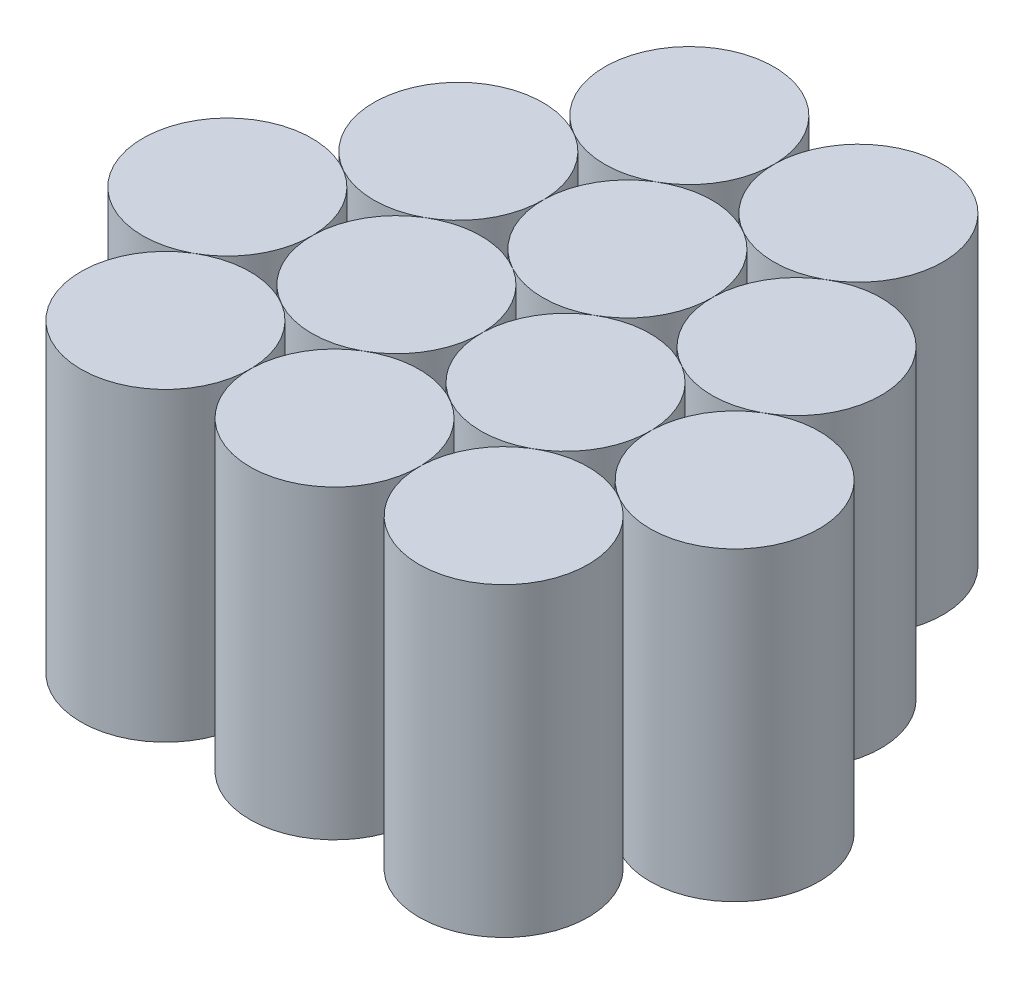
ISO-10303-21;
HEADER;
FILE_DESCRIPTION(('STEP AP214'),'2;1');
FILE_NAME('part.step','',(''),(''),'','','');
FILE_SCHEMA(('AUTOMOTIVE_DESIGN { 1 0 10303 214 1 1 1 1 }'));
ENDSEC;
DATA;
#1=APPLICATION_CONTEXT('core data for automotive mechanical design processes');
#2=APPLICATION_PROTOCOL_DEFINITION('international standard','automotive_design',2000,#1);
#3=PRODUCT_CONTEXT('',#1,'mechanical');
#4=PRODUCT('Part','Part','',(#3));
#5=PRODUCT_RELATED_PRODUCT_CATEGORY('part','',(#4));
#6=PRODUCT_DEFINITION_FORMATION('','',#4);
#7=PRODUCT_DEFINITION_CONTEXT('part definition',#1,'design');
#8=PRODUCT_DEFINITION('design','',#6,#7);
#9=PRODUCT_DEFINITION_SHAPE('','',#8);
#10=(LENGTH_UNIT() NAMED_UNIT(*) SI_UNIT(.MILLI.,.METRE.));
#11=(NAMED_UNIT(*) PLANE_ANGLE_UNIT() SI_UNIT($,.RADIAN.));
#12=(NAMED_UNIT(*) SI_UNIT($,.STERADIAN.) SOLID_ANGLE_UNIT());
#13=UNCERTAINTY_MEASURE_WITH_UNIT(LENGTH_MEASURE(1.E-05),#10,'distance_accuracy_value','');
#14=(GEOMETRIC_REPRESENTATION_CONTEXT(3) GLOBAL_UNCERTAINTY_ASSIGNED_CONTEXT((#13)) GLOBAL_UNIT_ASSIGNED_CONTEXT((#10,
#11,#12)) REPRESENTATION_CONTEXT('',''));
#15=CARTESIAN_POINT('',(0.,0.,0.));
#16=DIRECTION('',(0.,0.,1.));
#17=DIRECTION('',(1.,0.,0.));
#18=AXIS2_PLACEMENT_3D('',#15,#16,#17);
#19=CARTESIAN_POINT('',(34.036,61.5,39.3013875242762));
#20=DIRECTION('',(0.,-1.,0.));
#21=DIRECTION('',(0.,0.,-1.));
#22=AXIS2_PLACEMENT_3D('',#19,#20,#21);
#23=CYLINDRICAL_SURFACE('',#22,17.018);
#24=CARTESIAN_POINT('',(34.036,0.,39.3013875242762));
#25=DIRECTION('',(0.,1.,0.));
#26=DIRECTION('',(0.,0.,1.));
#27=AXIS2_PLACEMENT_3D('',#24,#25,#26);
#28=CIRCLE('',#27,17.018);
#29=CARTESIAN_POINT('',(34.036,0.,56.3193875242762));
#30=VERTEX_POINT('',#29);
#31=EDGE_CURVE('E12',#30,#30,#28,.T.);
#32=ORIENTED_EDGE('',*,*,#31,.T.);
#33=EDGE_LOOP('',(#32));
#34=FACE_BOUND('',#33,.T.);
#35=CARTESIAN_POINT('',(34.036,61.5,39.3013875242762));
#36=DIRECTION('',(0.,1.,0.));
#37=DIRECTION('',(0.,0.,1.));
#38=AXIS2_PLACEMENT_3D('',#35,#36,#37);
#39=CIRCLE('',#38,17.018);
#40=CARTESIAN_POINT('',(34.036,61.5,56.3193875242762));
#41=VERTEX_POINT('',#40);
#42=EDGE_CURVE('E187',#41,#41,#39,.T.);
#43=ORIENTED_EDGE('',*,*,#42,.F.);
#44=EDGE_LOOP('',(#43));
#45=FACE_BOUND('',#44,.T.);
#46=ADVANCED_FACE('F183',(#34,#45),#23,.T.);
#47=CARTESIAN_POINT('',(0.,61.5,0.));
#48=DIRECTION('',(0.,1.,0.));
#49=DIRECTION('',(0.,0.,1.));
#50=AXIS2_PLACEMENT_3D('',#47,#48,#49);
#51=PLANE('',#50);
#52=ORIENTED_EDGE('',*,*,#42,.T.);
#53=EDGE_LOOP('',(#52));
#54=FACE_BOUND('',#53,.T.);
#55=ADVANCED_FACE('F185',(#54),#51,.T.);
#56=CARTESIAN_POINT('',(0.,0.,0.));
#57=DIRECTION('',(0.,1.,0.));
#58=DIRECTION('',(0.,0.,1.));
#59=AXIS2_PLACEMENT_3D('',#56,#57,#58);
#60=PLANE('',#59);
#61=ORIENTED_EDGE('',*,*,#31,.F.);
#62=EDGE_LOOP('',(#61));
#63=FACE_BOUND('',#62,.T.);
#64=ADVANCED_FACE('F204',(#63),#60,.F.);
#65=CLOSED_SHELL('',(#46,#55,#64));
#66=MANIFOLD_SOLID_BREP('B2',#65);
#67=CARTESIAN_POINT('',(51.054,61.5,9.82534688106906));
#68=DIRECTION('',(0.,-1.,0.));
#69=DIRECTION('',(0.,0.,-1.));
#70=AXIS2_PLACEMENT_3D('',#67,#68,#69);
#71=CYLINDRICAL_SURFACE('',#70,17.018);
#72=CARTESIAN_POINT('',(51.054,0.,9.82534688106906));
#73=DIRECTION('',(0.,1.,0.));
#74=DIRECTION('',(0.,0.,1.));
#75=AXIS2_PLACEMENT_3D('',#72,#73,#74);
#76=CIRCLE('',#75,17.018);
#77=CARTESIAN_POINT('',(51.054,0.,26.8433468810691));
#78=VERTEX_POINT('',#77);
#79=EDGE_CURVE('E182',#78,#78,#76,.T.);
#80=ORIENTED_EDGE('',*,*,#79,.T.);
#81=EDGE_LOOP('',(#80));
#82=FACE_BOUND('',#81,.T.);
#83=CARTESIAN_POINT('',(51.054,61.5,9.82534688106906));
#84=DIRECTION('',(0.,1.,0.));
#85=DIRECTION('',(0.,0.,1.));
#86=AXIS2_PLACEMENT_3D('',#83,#84,#85);
#87=CIRCLE('',#86,17.018);
#88=CARTESIAN_POINT('',(51.054,61.5,26.8433468810691));
#89=VERTEX_POINT('',#88);
#90=EDGE_CURVE('E240',#89,#89,#87,.T.);
#91=ORIENTED_EDGE('',*,*,#90,.F.);
#92=EDGE_LOOP('',(#91));
#93=FACE_BOUND('',#92,.T.);
#94=ADVANCED_FACE('F236',(#82,#93),#71,.T.);
#95=CARTESIAN_POINT('',(0.,61.5,0.));
#96=DIRECTION('',(0.,1.,0.));
#97=DIRECTION('',(0.,0.,1.));
#98=AXIS2_PLACEMENT_3D('',#95,#96,#97);
#99=PLANE('',#98);
#100=ORIENTED_EDGE('',*,*,#90,.T.);
#101=EDGE_LOOP('',(#100));
#102=FACE_BOUND('',#101,.T.);
#103=ADVANCED_FACE('F238',(#102),#99,.T.);
#104=CARTESIAN_POINT('',(0.,0.,0.));
#105=DIRECTION('',(0.,1.,0.));
#106=DIRECTION('',(0.,0.,1.));
#107=AXIS2_PLACEMENT_3D('',#104,#105,#106);
#108=PLANE('',#107);
#109=ORIENTED_EDGE('',*,*,#79,.F.);
#110=EDGE_LOOP('',(#109));
#111=FACE_BOUND('',#110,.T.);
#112=ADVANCED_FACE('F257',(#111),#108,.F.);
#113=CLOSED_SHELL('',(#94,#103,#112));
#114=MANIFOLD_SOLID_BREP('B7',#113);
#115=CARTESIAN_POINT('',(0.,61.5,39.3013875242762));
#116=DIRECTION('',(0.,-1.,0.));
#117=DIRECTION('',(0.,0.,-1.));
#118=AXIS2_PLACEMENT_3D('',#115,#116,#117);
#119=CYLINDRICAL_SURFACE('',#118,17.018);
#120=CARTESIAN_POINT('',(0.,0.,39.3013875242762));
#121=DIRECTION('',(0.,1.,0.));
#122=DIRECTION('',(0.,0.,1.));
#123=AXIS2_PLACEMENT_3D('',#120,#121,#122);
#124=CIRCLE('',#123,17.018);
#125=CARTESIAN_POINT('',(0.,0.,56.3193875242762));
#126=VERTEX_POINT('',#125);
#127=EDGE_CURVE('E235',#126,#126,#124,.T.);
#128=ORIENTED_EDGE('',*,*,#127,.T.);
#129=EDGE_LOOP('',(#128));
#130=FACE_BOUND('',#129,.T.);
#131=CARTESIAN_POINT('',(0.,61.5,39.3013875242762));
#132=DIRECTION('',(0.,1.,0.));
#133=DIRECTION('',(0.,0.,1.));
#134=AXIS2_PLACEMENT_3D('',#131,#132,#133);
#135=CIRCLE('',#134,17.018);
#136=CARTESIAN_POINT('',(0.,61.5,56.3193875242762));
#137=VERTEX_POINT('',#136);
#138=EDGE_CURVE('E293',#137,#137,#135,.T.);
#139=ORIENTED_EDGE('',*,*,#138,.F.);
#140=EDGE_LOOP('',(#139));
#141=FACE_BOUND('',#140,.T.);
#142=ADVANCED_FACE('F289',(#130,#141),#119,.T.);
#143=CARTESIAN_POINT('',(0.,61.5,39.3013875242762));
#144=DIRECTION('',(0.,1.,0.));
#145=DIRECTION('',(0.,0.,1.));
#146=AXIS2_PLACEMENT_3D('',#143,#144,#145);
#147=PLANE('',#146);
#148=ORIENTED_EDGE('',*,*,#138,.T.);
#149=EDGE_LOOP('',(#148));
#150=FACE_BOUND('',#149,.T.);
#151=ADVANCED_FACE('F291',(#150),#147,.T.);
#152=CARTESIAN_POINT('',(0.,0.,39.3013875242762));
#153=DIRECTION('',(0.,1.,0.));
#154=DIRECTION('',(0.,0.,1.));
#155=AXIS2_PLACEMENT_3D('',#152,#153,#154);
#156=PLANE('',#155);
#157=ORIENTED_EDGE('',*,*,#127,.F.);
#158=EDGE_LOOP('',(#157));
#159=FACE_BOUND('',#158,.T.);
#160=ADVANCED_FACE('F309',(#159),#156,.F.);
#161=CLOSED_SHELL('',(#142,#151,#160));
#162=MANIFOLD_SOLID_BREP('B177',#161);
#163=CARTESIAN_POINT('',(17.018,61.5,9.82534688106906));
#164=DIRECTION('',(0.,-1.,0.));
#165=DIRECTION('',(0.,0.,-1.));
#166=AXIS2_PLACEMENT_3D('',#163,#164,#165);
#167=CYLINDRICAL_SURFACE('',#166,17.018);
#168=CARTESIAN_POINT('',(17.018,0.,9.82534688106906));
#169=DIRECTION('',(0.,1.,0.));
#170=DIRECTION('',(0.,0.,1.));
#171=AXIS2_PLACEMENT_3D('',#168,#169,#170);
#172=CIRCLE('',#171,17.018);
#173=CARTESIAN_POINT('',(17.018,0.,26.8433468810691));
#174=VERTEX_POINT('',#173);
#175=EDGE_CURVE('E288',#174,#174,#172,.T.);
#176=ORIENTED_EDGE('',*,*,#175,.T.);
#177=EDGE_LOOP('',(#176));
#178=FACE_BOUND('',#177,.T.);
#179=CARTESIAN_POINT('',(17.018,61.5,9.82534688106906));
#180=DIRECTION('',(0.,1.,0.));
#181=DIRECTION('',(0.,0.,1.));
#182=AXIS2_PLACEMENT_3D('',#179,#180,#181);
#183=CIRCLE('',#182,17.018);
#184=CARTESIAN_POINT('',(17.018,61.5,26.8433468810691));
#185=VERTEX_POINT('',#184);
#186=EDGE_CURVE('E344',#185,#185,#183,.T.);
#187=ORIENTED_EDGE('',*,*,#186,.F.);
#188=EDGE_LOOP('',(#187));
#189=FACE_BOUND('',#188,.T.);
#190=ADVANCED_FACE('F340',(#178,#189),#167,.T.);
#191=CARTESIAN_POINT('',(17.018,61.5,9.82534688106906));
#192=DIRECTION('',(0.,1.,0.));
#193=DIRECTION('',(0.,0.,1.));
#194=AXIS2_PLACEMENT_3D('',#191,#192,#193);
#195=PLANE('',#194);
#196=ORIENTED_EDGE('',*,*,#186,.T.);
#197=EDGE_LOOP('',(#196));
#198=FACE_BOUND('',#197,.T.);
#199=ADVANCED_FACE('F342',(#198),#195,.T.);
#200=CARTESIAN_POINT('',(17.018,0.,9.82534688106906));
#201=DIRECTION('',(0.,1.,0.));
#202=DIRECTION('',(0.,0.,1.));
#203=AXIS2_PLACEMENT_3D('',#200,#201,#202);
#204=PLANE('',#203);
#205=ORIENTED_EDGE('',*,*,#175,.F.);
#206=EDGE_LOOP('',(#205));
#207=FACE_BOUND('',#206,.T.);
#208=ADVANCED_FACE('F361',(#207),#204,.F.);
#209=CLOSED_SHELL('',(#190,#199,#208));
#210=MANIFOLD_SOLID_BREP('B230',#209);
#211=CARTESIAN_POINT('',(34.036,61.5,-19.6506937621381));
#212=DIRECTION('',(0.,-1.,0.));
#213=DIRECTION('',(0.,0.,-1.));
#214=AXIS2_PLACEMENT_3D('',#211,#212,#213);
#215=CYLINDRICAL_SURFACE('',#214,17.018);
#216=CARTESIAN_POINT('',(34.036,0.,-19.6506937621381));
#217=DIRECTION('',(0.,1.,0.));
#218=DIRECTION('',(0.,0.,1.));
#219=AXIS2_PLACEMENT_3D('',#216,#217,#218);
#220=CIRCLE('',#219,17.018);
#221=CARTESIAN_POINT('',(34.036,0.,-2.63269376213808));
#222=VERTEX_POINT('',#221);
#223=EDGE_CURVE('E339',#222,#222,#220,.T.);
#224=ORIENTED_EDGE('',*,*,#223,.T.);
#225=EDGE_LOOP('',(#224));
#226=FACE_BOUND('',#225,.T.);
#227=CARTESIAN_POINT('',(34.036,61.5,-19.6506937621381));
#228=DIRECTION('',(0.,1.,0.));
#229=DIRECTION('',(0.,0.,1.));
#230=AXIS2_PLACEMENT_3D('',#227,#228,#229);
#231=CIRCLE('',#230,17.018);
#232=CARTESIAN_POINT('',(34.036,61.5,-2.63269376213808));
#233=VERTEX_POINT('',#232);
#234=EDGE_CURVE('E397',#233,#233,#231,.T.);
#235=ORIENTED_EDGE('',*,*,#234,.F.);
#236=EDGE_LOOP('',(#235));
#237=FACE_BOUND('',#236,.T.);
#238=ADVANCED_FACE('F393',(#226,#237),#215,.T.);
#239=CARTESIAN_POINT('',(0.,61.5,0.));
#240=DIRECTION('',(0.,1.,0.));
#241=DIRECTION('',(0.,0.,1.));
#242=AXIS2_PLACEMENT_3D('',#239,#240,#241);
#243=PLANE('',#242);
#244=ORIENTED_EDGE('',*,*,#234,.T.);
#245=EDGE_LOOP('',(#244));
#246=FACE_BOUND('',#245,.T.);
#247=ADVANCED_FACE('F395',(#246),#243,.T.);
#248=CARTESIAN_POINT('',(0.,0.,0.));
#249=DIRECTION('',(0.,1.,0.));
#250=DIRECTION('',(0.,0.,1.));
#251=AXIS2_PLACEMENT_3D('',#248,#249,#250);
#252=PLANE('',#251);
#253=ORIENTED_EDGE('',*,*,#223,.F.);
#254=EDGE_LOOP('',(#253));
#255=FACE_BOUND('',#254,.T.);
#256=ADVANCED_FACE('F413',(#255),#252,.F.);
#257=CLOSED_SHELL('',(#238,#247,#256));
#258=MANIFOLD_SOLID_BREP('B283',#257);
#259=CARTESIAN_POINT('',(17.018,61.5,-49.1267344053453));
#260=DIRECTION('',(0.,-1.,0.));
#261=DIRECTION('',(0.,0.,-1.));
#262=AXIS2_PLACEMENT_3D('',#259,#260,#261);
#263=CYLINDRICAL_SURFACE('',#262,17.018);
#264=CARTESIAN_POINT('',(17.018,0.,-49.1267344053453));
#265=DIRECTION('',(0.,1.,0.));
#266=DIRECTION('',(0.,0.,1.));
#267=AXIS2_PLACEMENT_3D('',#264,#265,#266);
#268=CIRCLE('',#267,17.018);
#269=CARTESIAN_POINT('',(17.018,0.,-32.1087344053453));
#270=VERTEX_POINT('',#269);
#271=EDGE_CURVE('E392',#270,#270,#268,.T.);
#272=ORIENTED_EDGE('',*,*,#271,.T.);
#273=EDGE_LOOP('',(#272));
#274=FACE_BOUND('',#273,.T.);
#275=CARTESIAN_POINT('',(17.018,61.5,-49.1267344053453));
#276=DIRECTION('',(0.,1.,0.));
#277=DIRECTION('',(0.,0.,1.));
#278=AXIS2_PLACEMENT_3D('',#275,#276,#277);
#279=CIRCLE('',#278,17.018);
#280=CARTESIAN_POINT('',(17.018,61.5,-32.1087344053453));
#281=VERTEX_POINT('',#280);
#282=EDGE_CURVE('E448',#281,#281,#279,.T.);
#283=ORIENTED_EDGE('',*,*,#282,.F.);
#284=EDGE_LOOP('',(#283));
#285=FACE_BOUND('',#284,.T.);
#286=ADVANCED_FACE('F444',(#274,#285),#263,.T.);
#287=CARTESIAN_POINT('',(0.,61.5,0.));
#288=DIRECTION('',(0.,1.,0.));
#289=DIRECTION('',(0.,0.,1.));
#290=AXIS2_PLACEMENT_3D('',#287,#288,#289);
#291=PLANE('',#290);
#292=ORIENTED_EDGE('',*,*,#282,.T.);
#293=EDGE_LOOP('',(#292));
#294=FACE_BOUND('',#293,.T.);
#295=ADVANCED_FACE('F446',(#294),#291,.T.);
#296=CARTESIAN_POINT('',(0.,0.,0.));
#297=DIRECTION('',(0.,1.,0.));
#298=DIRECTION('',(0.,0.,1.));
#299=AXIS2_PLACEMENT_3D('',#296,#297,#298);
#300=PLANE('',#299);
#301=ORIENTED_EDGE('',*,*,#271,.F.);
#302=EDGE_LOOP('',(#301));
#303=FACE_BOUND('',#302,.T.);
#304=ADVANCED_FACE('F465',(#303),#300,.F.);
#305=CLOSED_SHELL('',(#286,#295,#304));
#306=MANIFOLD_SOLID_BREP('B334',#305);
#307=CARTESIAN_POINT('',(0.,61.5,-19.6506937621381));
#308=DIRECTION('',(0.,-1.,0.));
#309=DIRECTION('',(0.,0.,-1.));
#310=AXIS2_PLACEMENT_3D('',#307,#308,#309);
#311=CYLINDRICAL_SURFACE('',#310,17.018);
#312=CARTESIAN_POINT('',(0.,0.,-19.6506937621381));
#313=DIRECTION('',(0.,1.,0.));
#314=DIRECTION('',(0.,0.,1.));
#315=AXIS2_PLACEMENT_3D('',#312,#313,#314);
#316=CIRCLE('',#315,17.018);
#317=CARTESIAN_POINT('',(0.,0.,-2.63269376213809));
#318=VERTEX_POINT('',#317);
#319=EDGE_CURVE('E443',#318,#318,#316,.T.);
#320=ORIENTED_EDGE('',*,*,#319,.T.);
#321=EDGE_LOOP('',(#320));
#322=FACE_BOUND('',#321,.T.);
#323=CARTESIAN_POINT('',(0.,61.5,-19.6506937621381));
#324=DIRECTION('',(0.,1.,0.));
#325=DIRECTION('',(0.,0.,1.));
#326=AXIS2_PLACEMENT_3D('',#323,#324,#325);
#327=CIRCLE('',#326,17.018);
#328=CARTESIAN_POINT('',(0.,61.5,-2.63269376213809));
#329=VERTEX_POINT('',#328);
#330=EDGE_CURVE('E500',#329,#329,#327,.T.);
#331=ORIENTED_EDGE('',*,*,#330,.F.);
#332=EDGE_LOOP('',(#331));
#333=FACE_BOUND('',#332,.T.);
#334=ADVANCED_FACE('F496',(#322,#333),#311,.T.);
#335=CARTESIAN_POINT('',(0.,61.5,0.));
#336=DIRECTION('',(0.,1.,0.));
#337=DIRECTION('',(0.,0.,1.));
#338=AXIS2_PLACEMENT_3D('',#335,#336,#337);
#339=PLANE('',#338);
#340=ORIENTED_EDGE('',*,*,#330,.T.);
#341=EDGE_LOOP('',(#340));
#342=FACE_BOUND('',#341,.T.);
#343=ADVANCED_FACE('F498',(#342),#339,.T.);
#344=CARTESIAN_POINT('',(0.,0.,0.));
#345=DIRECTION('',(0.,1.,0.));
#346=DIRECTION('',(0.,0.,1.));
#347=AXIS2_PLACEMENT_3D('',#344,#345,#346);
#348=PLANE('',#347);
#349=ORIENTED_EDGE('',*,*,#319,.F.);
#350=EDGE_LOOP('',(#349));
#351=FACE_BOUND('',#350,.T.);
#352=ADVANCED_FACE('F515',(#351),#348,.F.);
#353=CLOSED_SHELL('',(#334,#343,#352));
#354=MANIFOLD_SOLID_BREP('B387',#353);
#355=CARTESIAN_POINT('',(-17.018,61.5,-49.1267344053453));
#356=DIRECTION('',(0.,-1.,0.));
#357=DIRECTION('',(0.,0.,-1.));
#358=AXIS2_PLACEMENT_3D('',#355,#356,#357);
#359=CYLINDRICAL_SURFACE('',#358,17.018);
#360=CARTESIAN_POINT('',(-17.018,0.,-49.1267344053453));
#361=DIRECTION('',(0.,1.,0.));
#362=DIRECTION('',(0.,0.,1.));
#363=AXIS2_PLACEMENT_3D('',#360,#361,#362);
#364=CIRCLE('',#363,17.018);
#365=CARTESIAN_POINT('',(-17.018,0.,-32.1087344053453));
#366=VERTEX_POINT('',#365);
#367=EDGE_CURVE('E495',#366,#366,#364,.T.);
#368=ORIENTED_EDGE('',*,*,#367,.T.);
#369=EDGE_LOOP('',(#368));
#370=FACE_BOUND('',#369,.T.);
#371=CARTESIAN_POINT('',(-17.018,61.5,-49.1267344053453));
#372=DIRECTION('',(0.,1.,0.));
#373=DIRECTION('',(0.,0.,1.));
#374=AXIS2_PLACEMENT_3D('',#371,#372,#373);
#375=CIRCLE('',#374,17.018);
#376=CARTESIAN_POINT('',(-17.018,61.5,-32.1087344053453));
#377=VERTEX_POINT('',#376);
#378=EDGE_CURVE('E549',#377,#377,#375,.T.);
#379=ORIENTED_EDGE('',*,*,#378,.F.);
#380=EDGE_LOOP('',(#379));
#381=FACE_BOUND('',#380,.T.);
#382=ADVANCED_FACE('F545',(#370,#381),#359,.T.);
#383=CARTESIAN_POINT('',(0.,61.5,0.));
#384=DIRECTION('',(0.,1.,0.));
#385=DIRECTION('',(0.,0.,1.));
#386=AXIS2_PLACEMENT_3D('',#383,#384,#385);
#387=PLANE('',#386);
#388=ORIENTED_EDGE('',*,*,#378,.T.);
#389=EDGE_LOOP('',(#388));
#390=FACE_BOUND('',#389,.T.);
#391=ADVANCED_FACE('F547',(#390),#387,.T.);
#392=CARTESIAN_POINT('',(0.,0.,0.));
#393=DIRECTION('',(0.,1.,0.));
#394=DIRECTION('',(0.,0.,1.));
#395=AXIS2_PLACEMENT_3D('',#392,#393,#394);
#396=PLANE('',#395);
#397=ORIENTED_EDGE('',*,*,#367,.F.);
#398=EDGE_LOOP('',(#397));
#399=FACE_BOUND('',#398,.T.);
#400=ADVANCED_FACE('F564',(#399),#396,.F.);
#401=CLOSED_SHELL('',(#382,#391,#400));
#402=MANIFOLD_SOLID_BREP('B438',#401);
#403=CARTESIAN_POINT('',(-34.036,61.5,-19.6506937621381));
#404=DIRECTION('',(0.,-1.,0.));
#405=DIRECTION('',(0.,0.,-1.));
#406=AXIS2_PLACEMENT_3D('',#403,#404,#405);
#407=CYLINDRICAL_SURFACE('',#406,17.018);
#408=CARTESIAN_POINT('',(-34.036,0.,-19.6506937621381));
#409=DIRECTION('',(0.,1.,0.));
#410=DIRECTION('',(0.,0.,1.));
#411=AXIS2_PLACEMENT_3D('',#408,#409,#410);
#412=CIRCLE('',#411,17.018);
#413=CARTESIAN_POINT('',(-34.036,0.,-2.63269376213809));
#414=VERTEX_POINT('',#413);
#415=EDGE_CURVE('E544',#414,#414,#412,.T.);
#416=ORIENTED_EDGE('',*,*,#415,.T.);
#417=EDGE_LOOP('',(#416));
#418=FACE_BOUND('',#417,.T.);
#419=CARTESIAN_POINT('',(-34.036,61.5,-19.6506937621381));
#420=DIRECTION('',(0.,1.,0.));
#421=DIRECTION('',(0.,0.,1.));
#422=AXIS2_PLACEMENT_3D('',#419,#420,#421);
#423=CIRCLE('',#422,17.018);
#424=CARTESIAN_POINT('',(-34.036,61.5,-2.63269376213809));
#425=VERTEX_POINT('',#424);
#426=EDGE_CURVE('E598',#425,#425,#423,.T.);
#427=ORIENTED_EDGE('',*,*,#426,.F.);
#428=EDGE_LOOP('',(#427));
#429=FACE_BOUND('',#428,.T.);
#430=ADVANCED_FACE('F594',(#418,#429),#407,.T.);
#431=CARTESIAN_POINT('',(0.,61.5,0.));
#432=DIRECTION('',(0.,1.,0.));
#433=DIRECTION('',(0.,0.,1.));
#434=AXIS2_PLACEMENT_3D('',#431,#432,#433);
#435=PLANE('',#434);
#436=ORIENTED_EDGE('',*,*,#426,.T.);
#437=EDGE_LOOP('',(#436));
#438=FACE_BOUND('',#437,.T.);
#439=ADVANCED_FACE('F596',(#438),#435,.T.);
#440=CARTESIAN_POINT('',(0.,0.,0.));
#441=DIRECTION('',(0.,1.,0.));
#442=DIRECTION('',(0.,0.,1.));
#443=AXIS2_PLACEMENT_3D('',#440,#441,#442);
#444=PLANE('',#443);
#445=ORIENTED_EDGE('',*,*,#415,.F.);
#446=EDGE_LOOP('',(#445));
#447=FACE_BOUND('',#446,.T.);
#448=ADVANCED_FACE('F615',(#447),#444,.F.);
#449=CLOSED_SHELL('',(#430,#439,#448));
#450=MANIFOLD_SOLID_BREP('B490',#449);
#451=CARTESIAN_POINT('',(-51.054,61.5,9.82534688106906));
#452=DIRECTION('',(0.,-1.,0.));
#453=DIRECTION('',(0.,0.,-1.));
#454=AXIS2_PLACEMENT_3D('',#451,#452,#453);
#455=CYLINDRICAL_SURFACE('',#454,17.018);
#456=CARTESIAN_POINT('',(-51.054,0.,9.82534688106906));
#457=DIRECTION('',(0.,1.,0.));
#458=DIRECTION('',(0.,0.,1.));
#459=AXIS2_PLACEMENT_3D('',#456,#457,#458);
#460=CIRCLE('',#459,17.018);
#461=CARTESIAN_POINT('',(-51.054,0.,26.8433468810691));
#462=VERTEX_POINT('',#461);
#463=EDGE_CURVE('E593',#462,#462,#460,.T.);
#464=ORIENTED_EDGE('',*,*,#463,.T.);
#465=EDGE_LOOP('',(#464));
#466=FACE_BOUND('',#465,.T.);
#467=CARTESIAN_POINT('',(-51.054,61.5,9.82534688106906));
#468=DIRECTION('',(0.,1.,0.));
#469=DIRECTION('',(0.,0.,1.));
#470=AXIS2_PLACEMENT_3D('',#467,#468,#469);
#471=CIRCLE('',#470,17.018);
#472=CARTESIAN_POINT('',(-51.054,61.5,26.8433468810691));
#473=VERTEX_POINT('',#472);
#474=EDGE_CURVE('E651',#473,#473,#471,.T.);
#475=ORIENTED_EDGE('',*,*,#474,.F.);
#476=EDGE_LOOP('',(#475));
#477=FACE_BOUND('',#476,.T.);
#478=ADVANCED_FACE('F647',(#466,#477),#455,.T.);
#479=CARTESIAN_POINT('',(-51.054,61.5,9.82534688106906));
#480=DIRECTION('',(0.,1.,0.));
#481=DIRECTION('',(0.,0.,1.));
#482=AXIS2_PLACEMENT_3D('',#479,#480,#481);
#483=PLANE('',#482);
#484=ORIENTED_EDGE('',*,*,#474,.T.);
#485=EDGE_LOOP('',(#484));
#486=FACE_BOUND('',#485,.T.);
#487=ADVANCED_FACE('F649',(#486),#483,.T.);
#488=CARTESIAN_POINT('',(-51.054,0.,9.82534688106906));
#489=DIRECTION('',(0.,1.,0.));
#490=DIRECTION('',(0.,0.,1.));
#491=AXIS2_PLACEMENT_3D('',#488,#489,#490);
#492=PLANE('',#491);
#493=ORIENTED_EDGE('',*,*,#463,.F.);
#494=EDGE_LOOP('',(#493));
#495=FACE_BOUND('',#494,.T.);
#496=ADVANCED_FACE('F666',(#495),#492,.F.);
#497=CLOSED_SHELL('',(#478,#487,#496));
#498=MANIFOLD_SOLID_BREP('B539',#497);
#499=CARTESIAN_POINT('',(-17.018,61.5,9.82534688106907));
#500=DIRECTION('',(0.,-1.,0.));
#501=DIRECTION('',(0.,0.,-1.));
#502=AXIS2_PLACEMENT_3D('',#499,#500,#501);
#503=CYLINDRICAL_SURFACE('',#502,17.018);
#504=CARTESIAN_POINT('',(-17.018,0.,9.82534688106907));
#505=DIRECTION('',(0.,1.,0.));
#506=DIRECTION('',(0.,0.,1.));
#507=AXIS2_PLACEMENT_3D('',#504,#505,#506);
#508=CIRCLE('',#507,17.018);
#509=CARTESIAN_POINT('',(-17.018,0.,26.8433468810691));
#510=VERTEX_POINT('',#509);
#511=EDGE_CURVE('E646',#510,#510,#508,.T.);
#512=ORIENTED_EDGE('',*,*,#511,.T.);
#513=EDGE_LOOP('',(#512));
#514=FACE_BOUND('',#513,.T.);
#515=CARTESIAN_POINT('',(-17.018,61.5,9.82534688106907));
#516=DIRECTION('',(0.,1.,0.));
#517=DIRECTION('',(0.,0.,1.));
#518=AXIS2_PLACEMENT_3D('',#515,#516,#517);
#519=CIRCLE('',#518,17.018);
#520=CARTESIAN_POINT('',(-17.018,61.5,26.8433468810691));
#521=VERTEX_POINT('',#520);
#522=EDGE_CURVE('E699',#521,#521,#519,.T.);
#523=ORIENTED_EDGE('',*,*,#522,.F.);
#524=EDGE_LOOP('',(#523));
#525=FACE_BOUND('',#524,.T.);
#526=ADVANCED_FACE('F695',(#514,#525),#503,.T.);
#527=CARTESIAN_POINT('',(-17.018,61.5,9.82534688106907));
#528=DIRECTION('',(0.,1.,0.));
#529=DIRECTION('',(0.,0.,1.));
#530=AXIS2_PLACEMENT_3D('',#527,#528,#529);
#531=PLANE('',#530);
#532=ORIENTED_EDGE('',*,*,#522,.T.);
#533=EDGE_LOOP('',(#532));
#534=FACE_BOUND('',#533,.T.);
#535=ADVANCED_FACE('F697',(#534),#531,.T.);
#536=CARTESIAN_POINT('',(-17.018,0.,9.82534688106907));
#537=DIRECTION('',(0.,1.,0.));
#538=DIRECTION('',(0.,0.,1.));
#539=AXIS2_PLACEMENT_3D('',#536,#537,#538);
#540=PLANE('',#539);
#541=ORIENTED_EDGE('',*,*,#511,.F.);
#542=EDGE_LOOP('',(#541));
#543=FACE_BOUND('',#542,.T.);
#544=ADVANCED_FACE('F716',(#543),#540,.F.);
#545=CLOSED_SHELL('',(#526,#535,#544));
#546=MANIFOLD_SOLID_BREP('B588',#545);
#547=CARTESIAN_POINT('',(-34.036,61.5,39.3013875242762));
#548=DIRECTION('',(0.,-1.,0.));
#549=DIRECTION('',(0.,0.,-1.));
#550=AXIS2_PLACEMENT_3D('',#547,#548,#549);
#551=CYLINDRICAL_SURFACE('',#550,17.018);
#552=CARTESIAN_POINT('',(-34.036,0.,39.3013875242762));
#553=DIRECTION('',(0.,1.,0.));
#554=DIRECTION('',(0.,0.,1.));
#555=AXIS2_PLACEMENT_3D('',#552,#553,#554);
#556=CIRCLE('',#555,17.018);
#557=CARTESIAN_POINT('',(-34.036,0.,56.3193875242762));
#558=VERTEX_POINT('',#557);
#559=EDGE_CURVE('E743',#558,#558,#556,.T.);
#560=ORIENTED_EDGE('',*,*,#559,.T.);
#561=EDGE_LOOP('',(#560));
#562=FACE_BOUND('',#561,.T.);
#563=CARTESIAN_POINT('',(-34.036,61.5,39.3013875242762));
#564=DIRECTION('',(0.,1.,0.));
#565=DIRECTION('',(0.,0.,1.));
#566=AXIS2_PLACEMENT_3D('',#563,#564,#565);
#567=CIRCLE('',#566,17.018);
#568=CARTESIAN_POINT('',(-34.036,61.5,56.3193875242762));
#569=VERTEX_POINT('',#568);
#570=EDGE_CURVE('E694',#569,#569,#567,.T.);
#571=ORIENTED_EDGE('',*,*,#570,.F.);
#572=EDGE_LOOP('',(#571));
#573=FACE_BOUND('',#572,.T.);
#574=ADVANCED_FACE('F740',(#562,#573),#551,.T.);
#575=CARTESIAN_POINT('',(-34.036,61.5,39.3013875242762));
#576=DIRECTION('',(0.,1.,0.));
#577=DIRECTION('',(0.,0.,1.));
#578=AXIS2_PLACEMENT_3D('',#575,#576,#577);
#579=PLANE('',#578);
#580=ORIENTED_EDGE('',*,*,#570,.T.);
#581=EDGE_LOOP('',(#580));
#582=FACE_BOUND('',#581,.T.);
#583=ADVANCED_FACE('F756',(#582),#579,.T.);
#584=CARTESIAN_POINT('',(-34.036,0.,39.3013875242762));
#585=DIRECTION('',(0.,1.,0.));
#586=DIRECTION('',(0.,0.,1.));
#587=AXIS2_PLACEMENT_3D('',#584,#585,#586);
#588=PLANE('',#587);
#589=ORIENTED_EDGE('',*,*,#559,.F.);
#590=EDGE_LOOP('',(#589));
#591=FACE_BOUND('',#590,.T.);
#592=ADVANCED_FACE('F754',(#591),#588,.F.);
#593=CLOSED_SHELL('',(#574,#583,#592));
#594=MANIFOLD_SOLID_BREP('B641',#593);
#595=ADVANCED_BREP_SHAPE_REPRESENTATION('',(#18,#66,#114,#162,#210,#258,#306,#354,#402,#450,
#498,#546,#594),#14);
#596=SHAPE_DEFINITION_REPRESENTATION(#9,#595);
ENDSEC;
END-ISO-10303-21;
